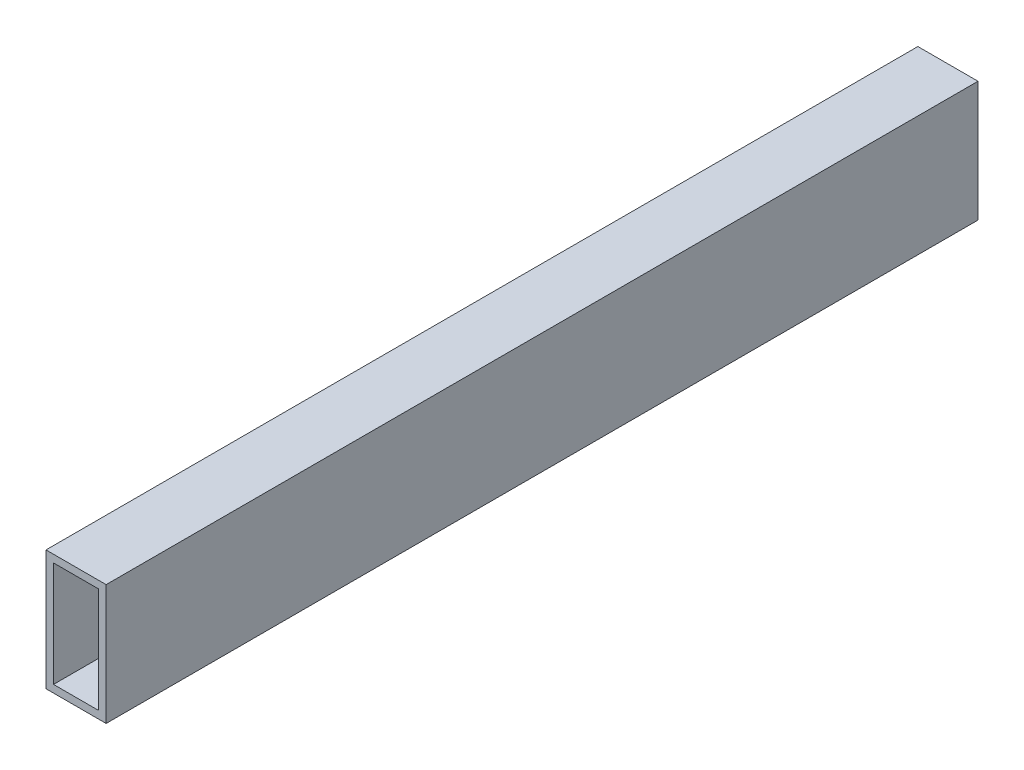
ISO-10303-21;
HEADER;
FILE_DESCRIPTION(('STEP AP214'),'2;1');
FILE_NAME('part.step','',(''),(''),'','','');
FILE_SCHEMA(('AUTOMOTIVE_DESIGN { 1 0 10303 214 1 1 1 1 }'));
ENDSEC;
DATA;
#1=APPLICATION_CONTEXT('core data for automotive mechanical design processes');
#2=APPLICATION_PROTOCOL_DEFINITION('international standard','automotive_design',2000,#1);
#3=PRODUCT_CONTEXT('',#1,'mechanical');
#4=PRODUCT('Part','Part','',(#3));
#5=PRODUCT_RELATED_PRODUCT_CATEGORY('part','',(#4));
#6=PRODUCT_DEFINITION_FORMATION('','',#4);
#7=PRODUCT_DEFINITION_CONTEXT('part definition',#1,'design');
#8=PRODUCT_DEFINITION('design','',#6,#7);
#9=PRODUCT_DEFINITION_SHAPE('','',#8);
#10=(LENGTH_UNIT() NAMED_UNIT(*) SI_UNIT(.MILLI.,.METRE.));
#11=(NAMED_UNIT(*) PLANE_ANGLE_UNIT() SI_UNIT($,.RADIAN.));
#12=(NAMED_UNIT(*) SI_UNIT($,.STERADIAN.) SOLID_ANGLE_UNIT());
#13=UNCERTAINTY_MEASURE_WITH_UNIT(LENGTH_MEASURE(1.E-05),#10,'distance_accuracy_value','');
#14=(GEOMETRIC_REPRESENTATION_CONTEXT(3) GLOBAL_UNCERTAINTY_ASSIGNED_CONTEXT((#13)) GLOBAL_UNIT_ASSIGNED_CONTEXT((#10,
#11,#12)) REPRESENTATION_CONTEXT('',''));
#15=CARTESIAN_POINT('',(0.,0.,0.));
#16=DIRECTION('',(0.,0.,1.));
#17=DIRECTION('',(1.,0.,0.));
#18=AXIS2_PLACEMENT_3D('',#15,#16,#17);
#19=CARTESIAN_POINT('',(0.,0.,184.15));
#20=DIRECTION('',(0.,0.,1.));
#21=DIRECTION('',(1.,0.,0.));
#22=AXIS2_PLACEMENT_3D('',#19,#20,#21);
#23=PLANE('',#22);
#24=DIRECTION('',(0.,1.,0.));
#25=VECTOR('',#24,1.);
#26=CARTESIAN_POINT('',(12.7,25.4,184.15));
#27=LINE('',#26,#25);
#28=CARTESIAN_POINT('',(12.7,-25.4,184.15));
#29=VERTEX_POINT('',#28);
#30=CARTESIAN_POINT('',(12.7,25.4,184.15));
#31=VERTEX_POINT('',#30);
#32=EDGE_CURVE('E135',#29,#31,#27,.T.);
#33=ORIENTED_EDGE('',*,*,#32,.T.);
#34=DIRECTION('',(-1.,0.,0.));
#35=VECTOR('',#34,1.);
#36=CARTESIAN_POINT('',(-12.7,25.4,184.15));
#37=LINE('',#36,#35);
#38=CARTESIAN_POINT('',(-12.7,25.4,184.15));
#39=VERTEX_POINT('',#38);
#40=EDGE_CURVE('E138',#31,#39,#37,.T.);
#41=ORIENTED_EDGE('',*,*,#40,.T.);
#42=DIRECTION('',(0.,-1.,0.));
#43=VECTOR('',#42,1.);
#44=CARTESIAN_POINT('',(-12.7,25.4,184.15));
#45=LINE('',#44,#43);
#46=CARTESIAN_POINT('',(-12.7,-25.4,184.15));
#47=VERTEX_POINT('',#46);
#48=EDGE_CURVE('E141',#39,#47,#45,.T.);
#49=ORIENTED_EDGE('',*,*,#48,.T.);
#50=DIRECTION('',(1.,0.,0.));
#51=VECTOR('',#50,1.);
#52=CARTESIAN_POINT('',(-12.7,-25.4,184.15));
#53=LINE('',#52,#51);
#54=EDGE_CURVE('E143',#47,#29,#53,.T.);
#55=ORIENTED_EDGE('',*,*,#54,.T.);
#56=EDGE_LOOP('',(#33,#41,#49,#55));
#57=FACE_BOUND('',#56,.T.);
#58=DIRECTION('',(1.,0.,0.));
#59=VECTOR('',#58,1.);
#60=CARTESIAN_POINT('',(-9.52499999999999,-22.225,184.15));
#61=LINE('',#60,#59);
#62=CARTESIAN_POINT('',(-9.52499999999999,-22.225,184.15));
#63=VERTEX_POINT('',#62);
#64=CARTESIAN_POINT('',(9.52500000000001,-22.225,184.15));
#65=VERTEX_POINT('',#64);
#66=EDGE_CURVE('E107',#63,#65,#61,.T.);
#67=ORIENTED_EDGE('',*,*,#66,.F.);
#68=DIRECTION('',(0.,-1.,0.));
#69=VECTOR('',#68,1.);
#70=CARTESIAN_POINT('',(-9.525,22.225,184.15));
#71=LINE('',#70,#69);
#72=CARTESIAN_POINT('',(-9.525,22.225,184.15));
#73=VERTEX_POINT('',#72);
#74=EDGE_CURVE('E99',#73,#63,#71,.T.);
#75=ORIENTED_EDGE('',*,*,#74,.F.);
#76=DIRECTION('',(-1.,0.,0.));
#77=VECTOR('',#76,1.);
#78=CARTESIAN_POINT('',(-9.525,22.225,184.15));
#79=LINE('',#78,#77);
#80=CARTESIAN_POINT('',(9.52499999999999,22.225,184.15));
#81=VERTEX_POINT('',#80);
#82=EDGE_CURVE('E121',#81,#73,#79,.T.);
#83=ORIENTED_EDGE('',*,*,#82,.F.);
#84=DIRECTION('',(0.,1.,0.));
#85=VECTOR('',#84,1.);
#86=CARTESIAN_POINT('',(9.52499999999999,22.225,184.15));
#87=LINE('',#86,#85);
#88=EDGE_CURVE('E119',#65,#81,#87,.T.);
#89=ORIENTED_EDGE('',*,*,#88,.F.);
#90=EDGE_LOOP('',(#67,#75,#83,#89));
#91=FACE_BOUND('',#90,.T.);
#92=ADVANCED_FACE('F34',(#57,#91),#23,.T.);
#93=CARTESIAN_POINT('',(0.,0.,-184.15));
#94=DIRECTION('',(0.,0.,1.));
#95=DIRECTION('',(1.,0.,0.));
#96=AXIS2_PLACEMENT_3D('',#93,#94,#95);
#97=PLANE('',#96);
#98=DIRECTION('',(0.,1.,0.));
#99=VECTOR('',#98,1.);
#100=CARTESIAN_POINT('',(12.7,25.4,-184.15));
#101=LINE('',#100,#99);
#102=CARTESIAN_POINT('',(12.7,-25.4,-184.15));
#103=VERTEX_POINT('',#102);
#104=CARTESIAN_POINT('',(12.7,25.4,-184.15));
#105=VERTEX_POINT('',#104);
#106=EDGE_CURVE('E115',#103,#105,#101,.T.);
#107=ORIENTED_EDGE('',*,*,#106,.F.);
#108=DIRECTION('',(1.,0.,0.));
#109=VECTOR('',#108,1.);
#110=CARTESIAN_POINT('',(-12.7,-25.4,-184.15));
#111=LINE('',#110,#109);
#112=CARTESIAN_POINT('',(-12.7,-25.4,-184.15));
#113=VERTEX_POINT('',#112);
#114=EDGE_CURVE('E139',#113,#103,#111,.T.);
#115=ORIENTED_EDGE('',*,*,#114,.F.);
#116=DIRECTION('',(0.,-1.,0.));
#117=VECTOR('',#116,1.);
#118=CARTESIAN_POINT('',(-12.7,25.4,-184.15));
#119=LINE('',#118,#117);
#120=CARTESIAN_POINT('',(-12.7,25.4,-184.15));
#121=VERTEX_POINT('',#120);
#122=EDGE_CURVE('E150',#121,#113,#119,.T.);
#123=ORIENTED_EDGE('',*,*,#122,.F.);
#124=DIRECTION('',(-1.,0.,0.));
#125=VECTOR('',#124,1.);
#126=CARTESIAN_POINT('',(-12.7,25.4,-184.15));
#127=LINE('',#126,#125);
#128=EDGE_CURVE('E148',#105,#121,#127,.T.);
#129=ORIENTED_EDGE('',*,*,#128,.F.);
#130=EDGE_LOOP('',(#107,#115,#123,#129));
#131=FACE_BOUND('',#130,.T.);
#132=DIRECTION('',(0.,-1.,0.));
#133=VECTOR('',#132,1.);
#134=CARTESIAN_POINT('',(-9.525,22.225,-184.15));
#135=LINE('',#134,#133);
#136=CARTESIAN_POINT('',(-9.525,22.225,-184.15));
#137=VERTEX_POINT('',#136);
#138=CARTESIAN_POINT('',(-9.52499999999999,-22.225,-184.15));
#139=VERTEX_POINT('',#138);
#140=EDGE_CURVE('E57',#137,#139,#135,.T.);
#141=ORIENTED_EDGE('',*,*,#140,.T.);
#142=DIRECTION('',(1.,0.,0.));
#143=VECTOR('',#142,1.);
#144=CARTESIAN_POINT('',(-9.52499999999999,-22.225,-184.15));
#145=LINE('',#144,#143);
#146=CARTESIAN_POINT('',(9.52500000000001,-22.225,-184.15));
#147=VERTEX_POINT('',#146);
#148=EDGE_CURVE('E114',#139,#147,#145,.T.);
#149=ORIENTED_EDGE('',*,*,#148,.T.);
#150=DIRECTION('',(0.,1.,0.));
#151=VECTOR('',#150,1.);
#152=CARTESIAN_POINT('',(9.52499999999999,22.225,-184.15));
#153=LINE('',#152,#151);
#154=CARTESIAN_POINT('',(9.52499999999999,22.225,-184.15));
#155=VERTEX_POINT('',#154);
#156=EDGE_CURVE('E127',#147,#155,#153,.T.);
#157=ORIENTED_EDGE('',*,*,#156,.T.);
#158=DIRECTION('',(-1.,0.,0.));
#159=VECTOR('',#158,1.);
#160=CARTESIAN_POINT('',(-9.525,22.225,-184.15));
#161=LINE('',#160,#159);
#162=EDGE_CURVE('E108',#155,#137,#161,.T.);
#163=ORIENTED_EDGE('',*,*,#162,.T.);
#164=EDGE_LOOP('',(#141,#149,#157,#163));
#165=FACE_BOUND('',#164,.T.);
#166=ADVANCED_FACE('F168',(#131,#165),#97,.F.);
#167=CARTESIAN_POINT('',(12.7,25.4,184.15));
#168=DIRECTION('',(-1.,0.,0.));
#169=DIRECTION('',(0.,0.,1.));
#170=AXIS2_PLACEMENT_3D('',#167,#168,#169);
#171=PLANE('',#170);
#172=ORIENTED_EDGE('',*,*,#106,.T.);
#173=DIRECTION('',(0.,0.,-1.));
#174=VECTOR('',#173,1.);
#175=CARTESIAN_POINT('',(12.7,25.4,184.15));
#176=LINE('',#175,#174);
#177=EDGE_CURVE('E11',#31,#105,#176,.T.);
#178=ORIENTED_EDGE('',*,*,#177,.F.);
#179=ORIENTED_EDGE('',*,*,#32,.F.);
#180=DIRECTION('',(0.,0.,-1.));
#181=VECTOR('',#180,1.);
#182=CARTESIAN_POINT('',(12.7,-25.4,184.15));
#183=LINE('',#182,#181);
#184=EDGE_CURVE('E145',#29,#103,#183,.T.);
#185=ORIENTED_EDGE('',*,*,#184,.T.);
#186=EDGE_LOOP('',(#172,#178,#179,#185));
#187=FACE_BOUND('',#186,.T.);
#188=ADVANCED_FACE('F36',(#187),#171,.F.);
#189=CARTESIAN_POINT('',(-12.7,25.4,184.15));
#190=DIRECTION('',(0.,-1.,0.));
#191=DIRECTION('',(0.,0.,-1.));
#192=AXIS2_PLACEMENT_3D('',#189,#190,#191);
#193=PLANE('',#192);
#194=ORIENTED_EDGE('',*,*,#128,.T.);
#195=DIRECTION('',(0.,0.,-1.));
#196=VECTOR('',#195,1.);
#197=CARTESIAN_POINT('',(-12.7,25.4,184.15));
#198=LINE('',#197,#196);
#199=EDGE_CURVE('E42',#39,#121,#198,.T.);
#200=ORIENTED_EDGE('',*,*,#199,.F.);
#201=ORIENTED_EDGE('',*,*,#40,.F.);
#202=ORIENTED_EDGE('',*,*,#177,.T.);
#203=EDGE_LOOP('',(#194,#200,#201,#202));
#204=FACE_BOUND('',#203,.T.);
#205=ADVANCED_FACE('F178',(#204),#193,.F.);
#206=CARTESIAN_POINT('',(-12.7,25.4,184.15));
#207=DIRECTION('',(1.,0.,0.));
#208=DIRECTION('',(0.,1.,0.));
#209=AXIS2_PLACEMENT_3D('',#206,#207,#208);
#210=PLANE('',#209);
#211=ORIENTED_EDGE('',*,*,#122,.T.);
#212=DIRECTION('',(0.,0.,-1.));
#213=VECTOR('',#212,1.);
#214=CARTESIAN_POINT('',(-12.7,-25.4,184.15));
#215=LINE('',#214,#213);
#216=EDGE_CURVE('E155',#47,#113,#215,.T.);
#217=ORIENTED_EDGE('',*,*,#216,.F.);
#218=ORIENTED_EDGE('',*,*,#48,.F.);
#219=ORIENTED_EDGE('',*,*,#199,.T.);
#220=EDGE_LOOP('',(#211,#217,#218,#219));
#221=FACE_BOUND('',#220,.T.);
#222=ADVANCED_FACE('F162',(#221),#210,.F.);
#223=CARTESIAN_POINT('',(-12.7,-25.4,184.15));
#224=DIRECTION('',(0.,1.,0.));
#225=DIRECTION('',(-1.,0.,0.));
#226=AXIS2_PLACEMENT_3D('',#223,#224,#225);
#227=PLANE('',#226);
#228=ORIENTED_EDGE('',*,*,#114,.T.);
#229=ORIENTED_EDGE('',*,*,#184,.F.);
#230=ORIENTED_EDGE('',*,*,#54,.F.);
#231=ORIENTED_EDGE('',*,*,#216,.T.);
#232=EDGE_LOOP('',(#228,#229,#230,#231));
#233=FACE_BOUND('',#232,.T.);
#234=ADVANCED_FACE('F172',(#233),#227,.F.);
#235=CARTESIAN_POINT('',(-9.525,22.225,184.15));
#236=DIRECTION('',(1.,0.,0.));
#237=DIRECTION('',(0.,1.,0.));
#238=AXIS2_PLACEMENT_3D('',#235,#236,#237);
#239=PLANE('',#238);
#240=ORIENTED_EDGE('',*,*,#140,.F.);
#241=DIRECTION('',(0.,0.,-1.));
#242=VECTOR('',#241,1.);
#243=CARTESIAN_POINT('',(-9.525,22.225,184.15));
#244=LINE('',#243,#242);
#245=EDGE_CURVE('E103',#73,#137,#244,.T.);
#246=ORIENTED_EDGE('',*,*,#245,.F.);
#247=ORIENTED_EDGE('',*,*,#74,.T.);
#248=DIRECTION('',(0.,0.,-1.));
#249=VECTOR('',#248,1.);
#250=CARTESIAN_POINT('',(-9.52499999999999,-22.225,184.15));
#251=LINE('',#250,#249);
#252=EDGE_CURVE('E102',#63,#139,#251,.T.);
#253=ORIENTED_EDGE('',*,*,#252,.T.);
#254=EDGE_LOOP('',(#240,#246,#247,#253));
#255=FACE_BOUND('',#254,.T.);
#256=ADVANCED_FACE('F101',(#255),#239,.T.);
#257=CARTESIAN_POINT('',(-9.52499999999999,-22.225,184.15));
#258=DIRECTION('',(0.,1.,0.));
#259=DIRECTION('',(0.,0.,1.));
#260=AXIS2_PLACEMENT_3D('',#257,#258,#259);
#261=PLANE('',#260);
#262=ORIENTED_EDGE('',*,*,#148,.F.);
#263=ORIENTED_EDGE('',*,*,#252,.F.);
#264=ORIENTED_EDGE('',*,*,#66,.T.);
#265=DIRECTION('',(0.,0.,-1.));
#266=VECTOR('',#265,1.);
#267=CARTESIAN_POINT('',(9.52500000000001,-22.225,184.15));
#268=LINE('',#267,#266);
#269=EDGE_CURVE('E116',#65,#147,#268,.T.);
#270=ORIENTED_EDGE('',*,*,#269,.T.);
#271=EDGE_LOOP('',(#262,#263,#264,#270));
#272=FACE_BOUND('',#271,.T.);
#273=ADVANCED_FACE('F111',(#272),#261,.T.);
#274=CARTESIAN_POINT('',(9.52499999999999,22.225,184.15));
#275=DIRECTION('',(-1.,0.,0.));
#276=DIRECTION('',(0.,-1.,0.));
#277=AXIS2_PLACEMENT_3D('',#274,#275,#276);
#278=PLANE('',#277);
#279=ORIENTED_EDGE('',*,*,#156,.F.);
#280=ORIENTED_EDGE('',*,*,#269,.F.);
#281=ORIENTED_EDGE('',*,*,#88,.T.);
#282=DIRECTION('',(0.,0.,-1.));
#283=VECTOR('',#282,1.);
#284=CARTESIAN_POINT('',(9.52499999999999,22.225,184.15));
#285=LINE('',#284,#283);
#286=EDGE_CURVE('E49',#81,#155,#285,.T.);
#287=ORIENTED_EDGE('',*,*,#286,.T.);
#288=EDGE_LOOP('',(#279,#280,#281,#287));
#289=FACE_BOUND('',#288,.T.);
#290=ADVANCED_FACE('F201',(#289),#278,.T.);
#291=CARTESIAN_POINT('',(-9.525,22.225,184.15));
#292=DIRECTION('',(0.,-1.,0.));
#293=DIRECTION('',(0.,0.,-1.));
#294=AXIS2_PLACEMENT_3D('',#291,#292,#293);
#295=PLANE('',#294);
#296=ORIENTED_EDGE('',*,*,#162,.F.);
#297=ORIENTED_EDGE('',*,*,#286,.F.);
#298=ORIENTED_EDGE('',*,*,#82,.T.);
#299=ORIENTED_EDGE('',*,*,#245,.T.);
#300=EDGE_LOOP('',(#296,#297,#298,#299));
#301=FACE_BOUND('',#300,.T.);
#302=ADVANCED_FACE('F205',(#301),#295,.T.);
#303=CLOSED_SHELL('',(#92,#166,#188,#205,#222,#234,#256,#273,#290,#302));
#304=MANIFOLD_SOLID_BREP('B2',#303);
#305=ADVANCED_BREP_SHAPE_REPRESENTATION('',(#18,#304),#14);
#306=SHAPE_DEFINITION_REPRESENTATION(#9,#305);
ENDSEC;
END-ISO-10303-21;
